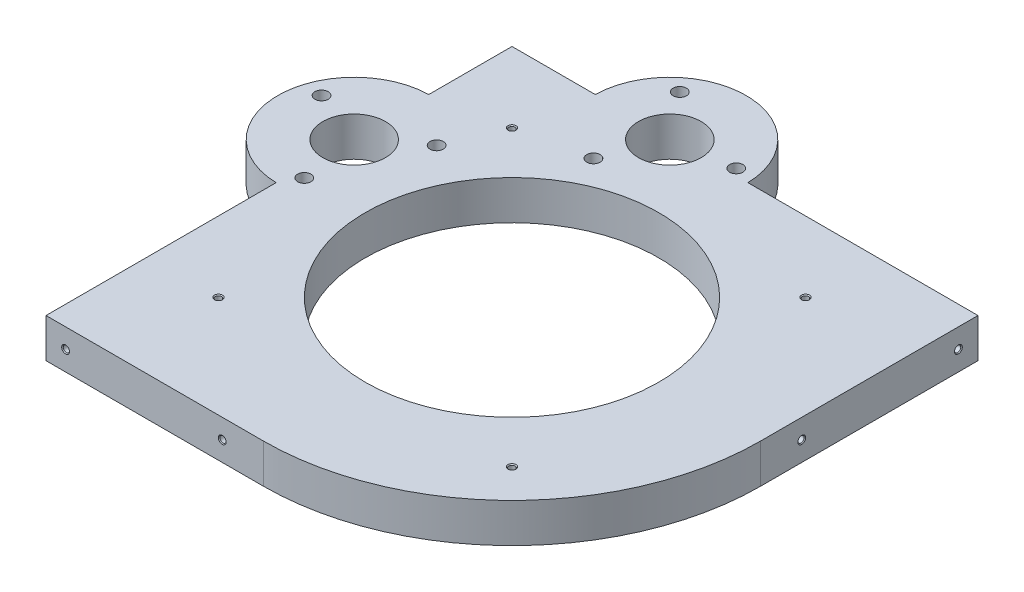
ISO-10303-21;
HEADER;
FILE_DESCRIPTION(('STEP AP214'),'2;1');
FILE_NAME('part.step','',(''),(''),'','','');
FILE_SCHEMA(('AUTOMOTIVE_DESIGN { 1 0 10303 214 1 1 1 1 }'));
ENDSEC;
DATA;
#1=APPLICATION_CONTEXT('core data for automotive mechanical design processes');
#2=APPLICATION_PROTOCOL_DEFINITION('international standard','automotive_design',2000,#1);
#3=PRODUCT_CONTEXT('',#1,'mechanical');
#4=PRODUCT('Part','Part','',(#3));
#5=PRODUCT_RELATED_PRODUCT_CATEGORY('part','',(#4));
#6=PRODUCT_DEFINITION_FORMATION('','',#4);
#7=PRODUCT_DEFINITION_CONTEXT('part definition',#1,'design');
#8=PRODUCT_DEFINITION('design','',#6,#7);
#9=PRODUCT_DEFINITION_SHAPE('','',#8);
#10=(LENGTH_UNIT() NAMED_UNIT(*) SI_UNIT(.MILLI.,.METRE.));
#11=(NAMED_UNIT(*) PLANE_ANGLE_UNIT() SI_UNIT($,.RADIAN.));
#12=(NAMED_UNIT(*) SI_UNIT($,.STERADIAN.) SOLID_ANGLE_UNIT());
#13=UNCERTAINTY_MEASURE_WITH_UNIT(LENGTH_MEASURE(1.E-05),#10,'distance_accuracy_value','');
#14=(GEOMETRIC_REPRESENTATION_CONTEXT(3) GLOBAL_UNCERTAINTY_ASSIGNED_CONTEXT((#13)) GLOBAL_UNIT_ASSIGNED_CONTEXT((#10,
#11,#12)) REPRESENTATION_CONTEXT('',''));
#15=CARTESIAN_POINT('',(0.,0.,0.));
#16=DIRECTION('',(0.,0.,1.));
#17=DIRECTION('',(1.,0.,0.));
#18=AXIS2_PLACEMENT_3D('',#15,#16,#17);
#19=CARTESIAN_POINT('',(0.,0.,0.));
#20=DIRECTION('',(0.,1.,0.));
#21=DIRECTION('',(0.,0.,1.));
#22=AXIS2_PLACEMENT_3D('',#19,#20,#21);
#23=PLANE('',#22);
#24=CARTESIAN_POINT('',(-68.9755902570555,0.,-20.3468197938255));
#25=DIRECTION('',(0.,-1.,0.));
#26=DIRECTION('',(0.,0.,-1.));
#27=AXIS2_PLACEMENT_3D('',#24,#25,#26);
#28=CIRCLE('',#27,1.69999999999999);
#29=CARTESIAN_POINT('',(-68.9755902570555,0.,-22.0468197938255));
#30=VERTEX_POINT('',#29);
#31=EDGE_CURVE('E576',#30,#30,#28,.T.);
#32=ORIENTED_EDGE('',*,*,#31,.F.);
#33=EDGE_LOOP('',(#32));
#34=FACE_BOUND('',#33,.T.);
#35=CARTESIAN_POINT('',(-43.254200669905,0.,-24.0088025499335));
#36=DIRECTION('',(0.,-1.,0.));
#37=DIRECTION('',(0.,0.,-1.));
#38=AXIS2_PLACEMENT_3D('',#35,#36,#37);
#39=CIRCLE('',#38,1.69999999999999);
#40=CARTESIAN_POINT('',(-43.254200669905,0.,-25.7088025499335));
#41=VERTEX_POINT('',#40);
#42=EDGE_CURVE('E588',#41,#41,#39,.T.);
#43=ORIENTED_EDGE('',*,*,#42,.F.);
#44=EDGE_LOOP('',(#43));
#45=FACE_BOUND('',#44,.T.);
#46=CARTESIAN_POINT('',(-20.3468197938259,0.,-41.139953939898));
#47=DIRECTION('',(0.,-1.,0.));
#48=DIRECTION('',(0.,0.,-1.));
#49=AXIS2_PLACEMENT_3D('',#46,#47,#48);
#50=CIRCLE('',#49,1.69999999999999);
#51=CARTESIAN_POINT('',(-20.3468197938259,0.,-42.839953939898));
#52=VERTEX_POINT('',#51);
#53=EDGE_CURVE('E594',#52,#52,#50,.T.);
#54=ORIENTED_EDGE('',*,*,#53,.F.);
#55=EDGE_LOOP('',(#54));
#56=FACE_BOUND('',#55,.T.);
#57=CARTESIAN_POINT('',(0.0975656312287576,0.,-57.1720188284834));
#58=DIRECTION('',(0.,-1.,0.));
#59=DIRECTION('',(0.,0.,-1.));
#60=AXIS2_PLACEMENT_3D('',#57,#58,#59);
#61=CIRCLE('',#60,1.69999999999999);
#62=CARTESIAN_POINT('',(0.0975656312287576,0.,-58.8720188284834));
#63=VERTEX_POINT('',#62);
#64=EDGE_CURVE('E600',#63,#63,#61,.T.);
#65=ORIENTED_EDGE('',*,*,#64,.F.);
#66=EDGE_LOOP('',(#65));
#67=FACE_BOUND('',#66,.T.);
#68=CARTESIAN_POINT('',(-14.7526855708436,0.,-55.0577720984769));
#69=DIRECTION('',(0.,1.,0.));
#70=DIRECTION('',(0.,0.,1.));
#71=AXIS2_PLACEMENT_3D('',#68,#69,#70);
#72=CIRCLE('',#71,8.);
#73=CARTESIAN_POINT('',(-14.7526855708436,0.,-47.0577720984769));
#74=VERTEX_POINT('',#73);
#75=EDGE_CURVE('E505',#74,#74,#72,.T.);
#76=ORIENTED_EDGE('',*,*,#75,.T.);
#77=EDGE_LOOP('',(#76));
#78=FACE_BOUND('',#77,.T.);
#79=CARTESIAN_POINT('',(-55.0577720984769,0.,-14.7526855708436));
#80=DIRECTION('',(0.,1.,0.));
#81=DIRECTION('',(0.,0.,1.));
#82=AXIS2_PLACEMENT_3D('',#79,#80,#81);
#83=CIRCLE('',#82,8.);
#84=CARTESIAN_POINT('',(-55.0577720984769,0.,-6.75268557084363));
#85=VERTEX_POINT('',#84);
#86=EDGE_CURVE('E501',#85,#85,#83,.T.);
#87=ORIENTED_EDGE('',*,*,#86,.T.);
#88=EDGE_LOOP('',(#87));
#89=FACE_BOUND('',#88,.T.);
#90=CARTESIAN_POINT('',(-14.7526855708436,0.,-55.0577720984769));
#91=DIRECTION('',(0.,1.,0.));
#92=DIRECTION('',(0.,0.,1.));
#93=AXIS2_PLACEMENT_3D('',#90,#91,#92);
#94=CIRCLE('',#93,19.5);
#95=CARTESIAN_POINT('',(4.74229928380845,0.,-55.5));
#96=VERTEX_POINT('',#95);
#97=CARTESIAN_POINT('',(-34.2476704254957,0.,-55.5));
#98=VERTEX_POINT('',#97);
#99=EDGE_CURVE('E511',#96,#98,#94,.T.);
#100=ORIENTED_EDGE('',*,*,#99,.F.);
#101=DIRECTION('',(-1.,0.,0.));
#102=VECTOR('',#101,1.);
#103=CARTESIAN_POINT('',(-55.5,0.,-55.5));
#104=LINE('',#103,#102);
#105=CARTESIAN_POINT('',(63.5,0.,-55.5));
#106=VERTEX_POINT('',#105);
#107=EDGE_CURVE('E166',#106,#96,#104,.T.);
#108=ORIENTED_EDGE('',*,*,#107,.F.);
#109=DIRECTION('',(0.,0.,-1.));
#110=VECTOR('',#109,1.);
#111=CARTESIAN_POINT('',(63.5,0.,0.));
#112=LINE('',#111,#110);
#113=CARTESIAN_POINT('',(63.5,0.,0.));
#114=VERTEX_POINT('',#113);
#115=EDGE_CURVE('E189',#114,#106,#112,.T.);
#116=ORIENTED_EDGE('',*,*,#115,.F.);
#117=CARTESIAN_POINT('',(0.,0.,0.));
#118=DIRECTION('',(0.,1.,0.));
#119=DIRECTION('',(0.,0.,1.));
#120=AXIS2_PLACEMENT_3D('',#117,#118,#119);
#121=CIRCLE('',#120,63.5);
#122=CARTESIAN_POINT('',(0.,0.,63.5));
#123=VERTEX_POINT('',#122);
#124=EDGE_CURVE('E186',#123,#114,#121,.T.);
#125=ORIENTED_EDGE('',*,*,#124,.F.);
#126=DIRECTION('',(1.,0.,0.));
#127=VECTOR('',#126,1.);
#128=CARTESIAN_POINT('',(0.,0.,63.5));
#129=LINE('',#128,#127);
#130=CARTESIAN_POINT('',(-55.5,0.,63.5));
#131=VERTEX_POINT('',#130);
#132=EDGE_CURVE('E182',#131,#123,#129,.T.);
#133=ORIENTED_EDGE('',*,*,#132,.F.);
#134=DIRECTION('',(0.,0.,1.));
#135=VECTOR('',#134,1.);
#136=CARTESIAN_POINT('',(-55.5,0.,-55.5));
#137=LINE('',#136,#135);
#138=CARTESIAN_POINT('',(-55.5,0.,4.74229928380845));
#139=VERTEX_POINT('',#138);
#140=EDGE_CURVE('E183',#139,#131,#137,.T.);
#141=ORIENTED_EDGE('',*,*,#140,.F.);
#142=CARTESIAN_POINT('',(-55.0577720984769,0.,-14.7526855708436));
#143=DIRECTION('',(0.,1.,0.));
#144=DIRECTION('',(0.,0.,-1.));
#145=AXIS2_PLACEMENT_3D('',#142,#143,#144);
#146=CIRCLE('',#145,19.5);
#147=CARTESIAN_POINT('',(-55.5,0.,-34.2476704254957));
#148=VERTEX_POINT('',#147);
#149=EDGE_CURVE('E140',#148,#139,#146,.T.);
#150=ORIENTED_EDGE('',*,*,#149,.F.);
#151=CARTESIAN_POINT('',(-55.5,0.,-55.5));
#152=VERTEX_POINT('',#151);
#153=EDGE_CURVE('E149',#152,#148,#137,.T.);
#154=ORIENTED_EDGE('',*,*,#153,.F.);
#155=EDGE_CURVE('E192',#98,#152,#104,.T.);
#156=ORIENTED_EDGE('',*,*,#155,.F.);
#157=EDGE_LOOP('',(#100,#108,#116,#125,#133,#141,#150,#154,#156));
#158=FACE_BOUND('',#157,.T.);
#159=CARTESIAN_POINT('',(-37.476659402887,0.,-37.476659402887));
#160=DIRECTION('',(0.,1.,0.));
#161=DIRECTION('',(0.,0.,1.));
#162=AXIS2_PLACEMENT_3D('',#159,#160,#161);
#163=CIRCLE('',#162,0.799999999999988);
#164=CARTESIAN_POINT('',(-37.476659402887,0.,-36.676659402887));
#165=VERTEX_POINT('',#164);
#166=EDGE_CURVE('E293',#165,#165,#163,.T.);
#167=ORIENTED_EDGE('',*,*,#166,.T.);
#168=EDGE_LOOP('',(#167));
#169=FACE_BOUND('',#168,.T.);
#170=CARTESIAN_POINT('',(0.,0.,0.));
#171=DIRECTION('',(0.,1.,0.));
#172=DIRECTION('',(0.,0.,1.));
#173=AXIS2_PLACEMENT_3D('',#170,#171,#172);
#174=CIRCLE('',#173,37.5);
#175=CARTESIAN_POINT('',(0.,0.,37.5));
#176=VERTEX_POINT('',#175);
#177=EDGE_CURVE('E168',#176,#176,#174,.T.);
#178=ORIENTED_EDGE('',*,*,#177,.T.);
#179=EDGE_LOOP('',(#178));
#180=FACE_BOUND('',#179,.T.);
#181=CARTESIAN_POINT('',(37.476659402887,0.,37.476659402887));
#182=DIRECTION('',(0.,1.,0.));
#183=DIRECTION('',(0.,0.,1.));
#184=AXIS2_PLACEMENT_3D('',#181,#182,#183);
#185=CIRCLE('',#184,0.799999999999988);
#186=CARTESIAN_POINT('',(37.476659402887,0.,38.276659402887));
#187=VERTEX_POINT('',#186);
#188=EDGE_CURVE('E317',#187,#187,#185,.T.);
#189=ORIENTED_EDGE('',*,*,#188,.T.);
#190=EDGE_LOOP('',(#189));
#191=FACE_BOUND('',#190,.T.);
#192=CARTESIAN_POINT('',(-37.476659402887,0.,37.476659402887));
#193=DIRECTION('',(0.,1.,0.));
#194=DIRECTION('',(0.,0.,1.));
#195=AXIS2_PLACEMENT_3D('',#192,#193,#194);
#196=CIRCLE('',#195,0.799999999999988);
#197=CARTESIAN_POINT('',(-37.476659402887,0.,38.276659402887));
#198=VERTEX_POINT('',#197);
#199=EDGE_CURVE('E305',#198,#198,#196,.T.);
#200=ORIENTED_EDGE('',*,*,#199,.T.);
#201=EDGE_LOOP('',(#200));
#202=FACE_BOUND('',#201,.T.);
#203=CARTESIAN_POINT('',(37.476659402887,0.,-37.476659402887));
#204=DIRECTION('',(0.,1.,0.));
#205=DIRECTION('',(0.,0.,1.));
#206=AXIS2_PLACEMENT_3D('',#203,#204,#205);
#207=CIRCLE('',#206,0.799999999999988);
#208=CARTESIAN_POINT('',(37.476659402887,0.,-36.676659402887));
#209=VERTEX_POINT('',#208);
#210=EDGE_CURVE('E281',#209,#209,#207,.T.);
#211=ORIENTED_EDGE('',*,*,#210,.T.);
#212=EDGE_LOOP('',(#211));
#213=FACE_BOUND('',#212,.T.);
#214=CARTESIAN_POINT('',(-24.0088025499339,0.,-66.8613435270484));
#215=DIRECTION('',(0.,-1.,0.));
#216=DIRECTION('',(0.,0.,-1.));
#217=AXIS2_PLACEMENT_3D('',#214,#215,#216);
#218=CIRCLE('',#217,1.69999999999999);
#219=CARTESIAN_POINT('',(-24.0088025499339,0.,-68.5613435270484));
#220=VERTEX_POINT('',#219);
#221=EDGE_CURVE('E606',#220,#220,#218,.T.);
#222=ORIENTED_EDGE('',*,*,#221,.F.);
#223=EDGE_LOOP('',(#222));
#224=FACE_BOUND('',#223,.T.);
#225=CARTESIAN_POINT('',(-52.94352536847,0.,0.0975656312292017));
#226=DIRECTION('',(0.,-1.,0.));
#227=DIRECTION('',(0.,0.,-1.));
#228=AXIS2_PLACEMENT_3D('',#225,#226,#227);
#229=CIRCLE('',#228,1.69999999999999);
#230=CARTESIAN_POINT('',(-52.94352536847,0.,-1.60243436877079));
#231=VERTEX_POINT('',#230);
#232=EDGE_CURVE('E580',#231,#231,#229,.T.);
#233=ORIENTED_EDGE('',*,*,#232,.F.);
#234=EDGE_LOOP('',(#233));
#235=FACE_BOUND('',#234,.T.);
#236=ADVANCED_FACE('F50',(#34,#45,#56,#67,#78,#89,#158,#169,#180,#191,#202,#213,#224,#235),#23,.F.);
#237=CARTESIAN_POINT('',(-55.5,10.,-55.5));
#238=DIRECTION('',(1.,0.,0.));
#239=DIRECTION('',(0.,0.,-1.));
#240=AXIS2_PLACEMENT_3D('',#237,#238,#239);
#241=PLANE('',#240);
#242=ORIENTED_EDGE('',*,*,#153,.T.);
#243=DIRECTION('',(0.,1.,0.));
#244=VECTOR('',#243,1.);
#245=CARTESIAN_POINT('',(-55.5,0.,-34.2476704254957));
#246=LINE('',#245,#244);
#247=CARTESIAN_POINT('',(-55.5,10.,-34.2476704254957));
#248=VERTEX_POINT('',#247);
#249=EDGE_CURVE('E134',#148,#248,#246,.T.);
#250=ORIENTED_EDGE('',*,*,#249,.T.);
#251=DIRECTION('',(0.,0.,1.));
#252=VECTOR('',#251,1.);
#253=CARTESIAN_POINT('',(-55.5,10.,-55.5));
#254=LINE('',#253,#252);
#255=CARTESIAN_POINT('',(-55.5,10.,-55.5));
#256=VERTEX_POINT('',#255);
#257=EDGE_CURVE('E147',#256,#248,#254,.T.);
#258=ORIENTED_EDGE('',*,*,#257,.F.);
#259=DIRECTION('',(0.,-1.,0.));
#260=VECTOR('',#259,1.);
#261=CARTESIAN_POINT('',(-55.5,10.,-55.5));
#262=LINE('',#261,#260);
#263=EDGE_CURVE('E179',#256,#152,#262,.T.);
#264=ORIENTED_EDGE('',*,*,#263,.T.);
#265=EDGE_LOOP('',(#242,#250,#258,#264));
#266=FACE_BOUND('',#265,.T.);
#267=ADVANCED_FACE('F145',(#266),#241,.F.);
#268=CARTESIAN_POINT('',(-55.5,10.,-55.5));
#269=DIRECTION('',(0.,0.,1.));
#270=DIRECTION('',(1.,0.,0.));
#271=AXIS2_PLACEMENT_3D('',#268,#269,#270);
#272=PLANE('',#271);
#273=ORIENTED_EDGE('',*,*,#107,.T.);
#274=DIRECTION('',(0.,1.,0.));
#275=VECTOR('',#274,1.);
#276=CARTESIAN_POINT('',(4.74229928380845,0.,-55.5));
#277=LINE('',#276,#275);
#278=CARTESIAN_POINT('',(4.74229928380845,10.,-55.5));
#279=VERTEX_POINT('',#278);
#280=EDGE_CURVE('E523',#96,#279,#277,.T.);
#281=ORIENTED_EDGE('',*,*,#280,.T.);
#282=DIRECTION('',(-1.,0.,0.));
#283=VECTOR('',#282,1.);
#284=CARTESIAN_POINT('',(-55.5,10.,-55.5));
#285=LINE('',#284,#283);
#286=CARTESIAN_POINT('',(63.5,10.,-55.5));
#287=VERTEX_POINT('',#286);
#288=EDGE_CURVE('E176',#287,#279,#285,.T.);
#289=ORIENTED_EDGE('',*,*,#288,.F.);
#290=DIRECTION('',(0.,-1.,0.));
#291=VECTOR('',#290,1.);
#292=CARTESIAN_POINT('',(63.5,10.,-55.5));
#293=LINE('',#292,#291);
#294=EDGE_CURVE('E198',#287,#106,#293,.T.);
#295=ORIENTED_EDGE('',*,*,#294,.T.);
#296=EDGE_LOOP('',(#273,#281,#289,#295));
#297=FACE_BOUND('',#296,.T.);
#298=ADVANCED_FACE('F348',(#297),#272,.F.);
#299=CARTESIAN_POINT('',(0.,10.,0.));
#300=DIRECTION('',(0.,1.,0.));
#301=DIRECTION('',(0.,0.,1.));
#302=AXIS2_PLACEMENT_3D('',#299,#300,#301);
#303=PLANE('',#302);
#304=CARTESIAN_POINT('',(-68.9755902570555,10.,-20.3468197938255));
#305=DIRECTION('',(0.,-1.,0.));
#306=DIRECTION('',(0.,0.,-1.));
#307=AXIS2_PLACEMENT_3D('',#304,#305,#306);
#308=CIRCLE('',#307,1.69999999999999);
#309=CARTESIAN_POINT('',(-68.9755902570555,10.,-22.0468197938255));
#310=VERTEX_POINT('',#309);
#311=EDGE_CURVE('E471',#310,#310,#308,.T.);
#312=ORIENTED_EDGE('',*,*,#311,.T.);
#313=EDGE_LOOP('',(#312));
#314=FACE_BOUND('',#313,.T.);
#315=CARTESIAN_POINT('',(-52.94352536847,10.,0.0975656312292017));
#316=DIRECTION('',(0.,-1.,0.));
#317=DIRECTION('',(0.,0.,-1.));
#318=AXIS2_PLACEMENT_3D('',#315,#316,#317);
#319=CIRCLE('',#318,1.69999999999999);
#320=CARTESIAN_POINT('',(-52.94352536847,10.,-1.60243436877079));
#321=VERTEX_POINT('',#320);
#322=EDGE_CURVE('E475',#321,#321,#319,.T.);
#323=ORIENTED_EDGE('',*,*,#322,.T.);
#324=EDGE_LOOP('',(#323));
#325=FACE_BOUND('',#324,.T.);
#326=CARTESIAN_POINT('',(-43.254200669905,10.,-24.0088025499335));
#327=DIRECTION('',(0.,-1.,0.));
#328=DIRECTION('',(0.,0.,-1.));
#329=AXIS2_PLACEMENT_3D('',#326,#327,#328);
#330=CIRCLE('',#329,1.69999999999999);
#331=CARTESIAN_POINT('',(-43.254200669905,10.,-25.7088025499335));
#332=VERTEX_POINT('',#331);
#333=EDGE_CURVE('E479',#332,#332,#330,.T.);
#334=ORIENTED_EDGE('',*,*,#333,.T.);
#335=EDGE_LOOP('',(#334));
#336=FACE_BOUND('',#335,.T.);
#337=CARTESIAN_POINT('',(-20.3468197938259,10.,-41.139953939898));
#338=DIRECTION('',(0.,-1.,0.));
#339=DIRECTION('',(0.,0.,-1.));
#340=AXIS2_PLACEMENT_3D('',#337,#338,#339);
#341=CIRCLE('',#340,1.69999999999999);
#342=CARTESIAN_POINT('',(-20.3468197938259,10.,-42.839953939898));
#343=VERTEX_POINT('',#342);
#344=EDGE_CURVE('E483',#343,#343,#341,.T.);
#345=ORIENTED_EDGE('',*,*,#344,.T.);
#346=EDGE_LOOP('',(#345));
#347=FACE_BOUND('',#346,.T.);
#348=CARTESIAN_POINT('',(0.0975656312287576,10.,-57.1720188284834));
#349=DIRECTION('',(0.,-1.,0.));
#350=DIRECTION('',(0.,0.,-1.));
#351=AXIS2_PLACEMENT_3D('',#348,#349,#350);
#352=CIRCLE('',#351,1.69999999999999);
#353=CARTESIAN_POINT('',(0.0975656312287576,10.,-58.8720188284834));
#354=VERTEX_POINT('',#353);
#355=EDGE_CURVE('E487',#354,#354,#352,.T.);
#356=ORIENTED_EDGE('',*,*,#355,.T.);
#357=EDGE_LOOP('',(#356));
#358=FACE_BOUND('',#357,.T.);
#359=CARTESIAN_POINT('',(-24.0088025499339,10.,-66.8613435270484));
#360=DIRECTION('',(0.,-1.,0.));
#361=DIRECTION('',(0.,0.,-1.));
#362=AXIS2_PLACEMENT_3D('',#359,#360,#361);
#363=CIRCLE('',#362,1.69999999999999);
#364=CARTESIAN_POINT('',(-24.0088025499339,10.,-68.5613435270484));
#365=VERTEX_POINT('',#364);
#366=EDGE_CURVE('E491',#365,#365,#363,.T.);
#367=ORIENTED_EDGE('',*,*,#366,.T.);
#368=EDGE_LOOP('',(#367));
#369=FACE_BOUND('',#368,.T.);
#370=CARTESIAN_POINT('',(-14.7526855708436,10.,-55.0577720984769));
#371=DIRECTION('',(0.,1.,0.));
#372=DIRECTION('',(0.,0.,1.));
#373=AXIS2_PLACEMENT_3D('',#370,#371,#372);
#374=CIRCLE('',#373,8.);
#375=CARTESIAN_POINT('',(-14.7526855708436,10.,-47.0577720984769));
#376=VERTEX_POINT('',#375);
#377=EDGE_CURVE('E495',#376,#376,#374,.T.);
#378=ORIENTED_EDGE('',*,*,#377,.F.);
#379=EDGE_LOOP('',(#378));
#380=FACE_BOUND('',#379,.T.);
#381=CARTESIAN_POINT('',(-55.0577720984769,10.,-14.7526855708436));
#382=DIRECTION('',(0.,1.,0.));
#383=DIRECTION('',(0.,0.,1.));
#384=AXIS2_PLACEMENT_3D('',#381,#382,#383);
#385=CIRCLE('',#384,8.);
#386=CARTESIAN_POINT('',(-55.0577720984769,10.,-6.75268557084363));
#387=VERTEX_POINT('',#386);
#388=EDGE_CURVE('E498',#387,#387,#385,.T.);
#389=ORIENTED_EDGE('',*,*,#388,.F.);
#390=EDGE_LOOP('',(#389));
#391=FACE_BOUND('',#390,.T.);
#392=ORIENTED_EDGE('',*,*,#288,.T.);
#393=CARTESIAN_POINT('',(-14.7526855708436,10.,-55.0577720984769));
#394=DIRECTION('',(0.,1.,0.));
#395=DIRECTION('',(0.,0.,1.));
#396=AXIS2_PLACEMENT_3D('',#393,#394,#395);
#397=CIRCLE('',#396,19.5);
#398=CARTESIAN_POINT('',(-34.2476704254957,10.,-55.5));
#399=VERTEX_POINT('',#398);
#400=EDGE_CURVE('E74',#279,#399,#397,.T.);
#401=ORIENTED_EDGE('',*,*,#400,.T.);
#402=EDGE_CURVE('E156',#399,#256,#285,.T.);
#403=ORIENTED_EDGE('',*,*,#402,.T.);
#404=ORIENTED_EDGE('',*,*,#257,.T.);
#405=CARTESIAN_POINT('',(-55.0577720984769,10.,-14.7526855708436));
#406=DIRECTION('',(0.,1.,0.));
#407=DIRECTION('',(0.,0.,-1.));
#408=AXIS2_PLACEMENT_3D('',#405,#406,#407);
#409=CIRCLE('',#408,19.5);
#410=CARTESIAN_POINT('',(-55.5,10.,4.74229928380845));
#411=VERTEX_POINT('',#410);
#412=EDGE_CURVE('E67',#248,#411,#409,.T.);
#413=ORIENTED_EDGE('',*,*,#412,.T.);
#414=CARTESIAN_POINT('',(-55.5,10.,63.5));
#415=VERTEX_POINT('',#414);
#416=EDGE_CURVE('E160',#411,#415,#254,.T.);
#417=ORIENTED_EDGE('',*,*,#416,.T.);
#418=DIRECTION('',(1.,0.,0.));
#419=VECTOR('',#418,1.);
#420=CARTESIAN_POINT('',(0.,10.,63.5));
#421=LINE('',#420,#419);
#422=CARTESIAN_POINT('',(0.,10.,63.5));
#423=VERTEX_POINT('',#422);
#424=EDGE_CURVE('E159',#415,#423,#421,.T.);
#425=ORIENTED_EDGE('',*,*,#424,.T.);
#426=CARTESIAN_POINT('',(0.,10.,0.));
#427=DIRECTION('',(0.,1.,0.));
#428=DIRECTION('',(0.,0.,1.));
#429=AXIS2_PLACEMENT_3D('',#426,#427,#428);
#430=CIRCLE('',#429,63.5);
#431=CARTESIAN_POINT('',(63.5,10.,0.));
#432=VERTEX_POINT('',#431);
#433=EDGE_CURVE('E164',#423,#432,#430,.T.);
#434=ORIENTED_EDGE('',*,*,#433,.T.);
#435=DIRECTION('',(0.,0.,-1.));
#436=VECTOR('',#435,1.);
#437=CARTESIAN_POINT('',(63.5,10.,0.));
#438=LINE('',#437,#436);
#439=EDGE_CURVE('E173',#432,#287,#438,.T.);
#440=ORIENTED_EDGE('',*,*,#439,.T.);
#441=EDGE_LOOP('',(#392,#401,#403,#404,#413,#417,#425,#434,#440));
#442=FACE_BOUND('',#441,.T.);
#443=CARTESIAN_POINT('',(0.,10.,0.));
#444=DIRECTION('',(0.,1.,0.));
#445=DIRECTION('',(0.,0.,1.));
#446=AXIS2_PLACEMENT_3D('',#443,#444,#445);
#447=CIRCLE('',#446,37.5);
#448=CARTESIAN_POINT('',(0.,10.,37.5));
#449=VERTEX_POINT('',#448);
#450=EDGE_CURVE('E320',#449,#449,#447,.T.);
#451=ORIENTED_EDGE('',*,*,#450,.F.);
#452=EDGE_LOOP('',(#451));
#453=FACE_BOUND('',#452,.T.);
#454=CARTESIAN_POINT('',(-37.476659402887,10.,-37.476659402887));
#455=DIRECTION('',(0.,1.,0.));
#456=DIRECTION('',(0.,0.,1.));
#457=AXIS2_PLACEMENT_3D('',#454,#455,#456);
#458=CIRCLE('',#457,1.025);
#459=CARTESIAN_POINT('',(-37.476659402887,10.,-36.451659402887));
#460=VERTEX_POINT('',#459);
#461=EDGE_CURVE('E285',#460,#460,#458,.T.);
#462=ORIENTED_EDGE('',*,*,#461,.F.);
#463=EDGE_LOOP('',(#462));
#464=FACE_BOUND('',#463,.T.);
#465=CARTESIAN_POINT('',(37.476659402887,10.,37.476659402887));
#466=DIRECTION('',(0.,1.,0.));
#467=DIRECTION('',(0.,0.,1.));
#468=AXIS2_PLACEMENT_3D('',#465,#466,#467);
#469=CIRCLE('',#468,1.025);
#470=CARTESIAN_POINT('',(37.476659402887,10.,38.501659402887));
#471=VERTEX_POINT('',#470);
#472=EDGE_CURVE('E309',#471,#471,#469,.T.);
#473=ORIENTED_EDGE('',*,*,#472,.F.);
#474=EDGE_LOOP('',(#473));
#475=FACE_BOUND('',#474,.T.);
#476=CARTESIAN_POINT('',(-37.476659402887,10.,37.476659402887));
#477=DIRECTION('',(0.,1.,0.));
#478=DIRECTION('',(0.,0.,1.));
#479=AXIS2_PLACEMENT_3D('',#476,#477,#478);
#480=CIRCLE('',#479,1.025);
#481=CARTESIAN_POINT('',(-37.476659402887,10.,38.501659402887));
#482=VERTEX_POINT('',#481);
#483=EDGE_CURVE('E297',#482,#482,#480,.T.);
#484=ORIENTED_EDGE('',*,*,#483,.F.);
#485=EDGE_LOOP('',(#484));
#486=FACE_BOUND('',#485,.T.);
#487=CARTESIAN_POINT('',(37.476659402887,10.,-37.476659402887));
#488=DIRECTION('',(0.,1.,0.));
#489=DIRECTION('',(0.,0.,1.));
#490=AXIS2_PLACEMENT_3D('',#487,#488,#489);
#491=CIRCLE('',#490,1.025);
#492=CARTESIAN_POINT('',(37.476659402887,10.,-36.451659402887));
#493=VERTEX_POINT('',#492);
#494=EDGE_CURVE('E267',#493,#493,#491,.T.);
#495=ORIENTED_EDGE('',*,*,#494,.F.);
#496=EDGE_LOOP('',(#495));
#497=FACE_BOUND('',#496,.T.);
#498=ADVANCED_FACE('F153',(#314,#325,#336,#347,#358,#369,#380,#391,#442,#453,#464,#475,#486,
#497),#303,.T.);
#499=ORIENTED_EDGE('',*,*,#416,.F.);
#500=DIRECTION('',(0.,1.,0.));
#501=VECTOR('',#500,1.);
#502=CARTESIAN_POINT('',(-55.5,0.,4.74229928380845));
#503=LINE('',#502,#501);
#504=EDGE_CURVE('E137',#411,#139,#503,.F.);
#505=ORIENTED_EDGE('',*,*,#504,.T.);
#506=ORIENTED_EDGE('',*,*,#140,.T.);
#507=DIRECTION('',(0.,-1.,0.));
#508=VECTOR('',#507,1.);
#509=CARTESIAN_POINT('',(-55.5,10.,63.5));
#510=LINE('',#509,#508);
#511=EDGE_CURVE('E210',#415,#131,#510,.T.);
#512=ORIENTED_EDGE('',*,*,#511,.F.);
#513=EDGE_LOOP('',(#499,#505,#506,#512));
#514=FACE_BOUND('',#513,.T.);
#515=ADVANCED_FACE('F359',(#514),#241,.F.);
#516=CARTESIAN_POINT('',(0.,10.,63.5));
#517=DIRECTION('',(0.,0.,-1.));
#518=DIRECTION('',(-1.,0.,0.));
#519=AXIS2_PLACEMENT_3D('',#516,#517,#518);
#520=PLANE('',#519);
#521=CARTESIAN_POINT('',(-50.5,5.,63.5));
#522=DIRECTION('',(0.,0.,-1.));
#523=DIRECTION('',(-1.,0.,0.));
#524=AXIS2_PLACEMENT_3D('',#521,#522,#523);
#525=CIRCLE('',#524,0.999999999999959);
#526=CARTESIAN_POINT('',(-51.5,5.,63.5));
#527=VERTEX_POINT('',#526);
#528=EDGE_CURVE('E60',#527,#527,#525,.T.);
#529=ORIENTED_EDGE('',*,*,#528,.T.);
#530=EDGE_LOOP('',(#529));
#531=FACE_BOUND('',#530,.T.);
#532=CARTESIAN_POINT('',(-10.5,5.,63.5));
#533=DIRECTION('',(0.,0.,-1.));
#534=DIRECTION('',(-1.,0.,0.));
#535=AXIS2_PLACEMENT_3D('',#532,#533,#534);
#536=CIRCLE('',#535,1.);
#537=CARTESIAN_POINT('',(-11.5,5.,63.5));
#538=VERTEX_POINT('',#537);
#539=EDGE_CURVE('E234',#538,#538,#536,.T.);
#540=ORIENTED_EDGE('',*,*,#539,.T.);
#541=EDGE_LOOP('',(#540));
#542=FACE_BOUND('',#541,.T.);
#543=ORIENTED_EDGE('',*,*,#132,.T.);
#544=DIRECTION('',(0.,-1.,0.));
#545=VECTOR('',#544,1.);
#546=CARTESIAN_POINT('',(0.,10.,63.5));
#547=LINE('',#546,#545);
#548=EDGE_CURVE('E206',#423,#123,#547,.T.);
#549=ORIENTED_EDGE('',*,*,#548,.F.);
#550=ORIENTED_EDGE('',*,*,#424,.F.);
#551=ORIENTED_EDGE('',*,*,#511,.T.);
#552=EDGE_LOOP('',(#543,#549,#550,#551));
#553=FACE_BOUND('',#552,.T.);
#554=ADVANCED_FACE('F241',(#531,#542,#553),#520,.F.);
#555=CARTESIAN_POINT('',(0.,10.,0.));
#556=DIRECTION('',(0.,-1.,0.));
#557=DIRECTION('',(0.,0.,-1.));
#558=AXIS2_PLACEMENT_3D('',#555,#556,#557);
#559=CYLINDRICAL_SURFACE('',#558,63.5);
#560=ORIENTED_EDGE('',*,*,#124,.T.);
#561=DIRECTION('',(0.,-1.,0.));
#562=VECTOR('',#561,1.);
#563=CARTESIAN_POINT('',(63.5,10.,0.));
#564=LINE('',#563,#562);
#565=EDGE_CURVE('E202',#432,#114,#564,.T.);
#566=ORIENTED_EDGE('',*,*,#565,.F.);
#567=ORIENTED_EDGE('',*,*,#433,.F.);
#568=ORIENTED_EDGE('',*,*,#548,.T.);
#569=EDGE_LOOP('',(#560,#566,#567,#568));
#570=FACE_BOUND('',#569,.T.);
#571=ADVANCED_FACE('F365',(#570),#559,.T.);
#572=CARTESIAN_POINT('',(63.5,10.,0.));
#573=DIRECTION('',(-1.,0.,0.));
#574=DIRECTION('',(0.,0.,1.));
#575=AXIS2_PLACEMENT_3D('',#572,#573,#574);
#576=PLANE('',#575);
#577=CARTESIAN_POINT('',(63.5,5.,-50.5));
#578=DIRECTION('',(-1.,0.,0.));
#579=DIRECTION('',(0.,0.,1.));
#580=AXIS2_PLACEMENT_3D('',#577,#578,#579);
#581=CIRCLE('',#580,0.999999999999959);
#582=CARTESIAN_POINT('',(63.5,5.,-49.5));
#583=VERTEX_POINT('',#582);
#584=EDGE_CURVE('E222',#583,#583,#581,.T.);
#585=ORIENTED_EDGE('',*,*,#584,.T.);
#586=EDGE_LOOP('',(#585));
#587=FACE_BOUND('',#586,.T.);
#588=CARTESIAN_POINT('',(63.5,5.,-10.5));
#589=DIRECTION('',(-1.,0.,0.));
#590=DIRECTION('',(0.,0.,1.));
#591=AXIS2_PLACEMENT_3D('',#588,#589,#590);
#592=CIRCLE('',#591,0.999999999999959);
#593=CARTESIAN_POINT('',(63.5,5.,-9.50000000000004));
#594=VERTEX_POINT('',#593);
#595=EDGE_CURVE('E218',#594,#594,#592,.T.);
#596=ORIENTED_EDGE('',*,*,#595,.T.);
#597=EDGE_LOOP('',(#596));
#598=FACE_BOUND('',#597,.T.);
#599=ORIENTED_EDGE('',*,*,#115,.T.);
#600=ORIENTED_EDGE('',*,*,#294,.F.);
#601=ORIENTED_EDGE('',*,*,#439,.F.);
#602=ORIENTED_EDGE('',*,*,#565,.T.);
#603=EDGE_LOOP('',(#599,#600,#601,#602));
#604=FACE_BOUND('',#603,.T.);
#605=ADVANCED_FACE('F345',(#587,#598,#604),#576,.F.);
#606=ORIENTED_EDGE('',*,*,#402,.F.);
#607=DIRECTION('',(0.,1.,0.));
#608=VECTOR('',#607,1.);
#609=CARTESIAN_POINT('',(-34.2476704254957,0.,-55.5));
#610=LINE('',#609,#608);
#611=EDGE_CURVE('E151',#399,#98,#610,.F.);
#612=ORIENTED_EDGE('',*,*,#611,.T.);
#613=ORIENTED_EDGE('',*,*,#155,.T.);
#614=ORIENTED_EDGE('',*,*,#263,.F.);
#615=EDGE_LOOP('',(#606,#612,#613,#614));
#616=FACE_BOUND('',#615,.T.);
#617=ADVANCED_FACE('F335',(#616),#272,.F.);
#618=CARTESIAN_POINT('',(0.,10.,0.));
#619=DIRECTION('',(0.,-1.,0.));
#620=DIRECTION('',(0.,0.,-1.));
#621=AXIS2_PLACEMENT_3D('',#618,#619,#620);
#622=CYLINDRICAL_SURFACE('',#621,37.5);
#623=ORIENTED_EDGE('',*,*,#450,.T.);
#624=EDGE_LOOP('',(#623));
#625=FACE_BOUND('',#624,.T.);
#626=ORIENTED_EDGE('',*,*,#177,.F.);
#627=EDGE_LOOP('',(#626));
#628=FACE_BOUND('',#627,.T.);
#629=ADVANCED_FACE('F332',(#625,#628),#622,.F.);
#630=CARTESIAN_POINT('',(37.476659402887,10.,37.476659402887));
#631=DIRECTION('',(0.,1.,0.));
#632=DIRECTION('',(0.,0.,1.));
#633=AXIS2_PLACEMENT_3D('',#630,#631,#632);
#634=CYLINDRICAL_SURFACE('',#633,0.799999999999995);
#635=ORIENTED_EDGE('',*,*,#188,.F.);
#636=EDGE_LOOP('',(#635));
#637=FACE_BOUND('',#636,.T.);
#638=CARTESIAN_POINT('',(37.476659402887,9.775,37.476659402887));
#639=DIRECTION('',(0.,1.,0.));
#640=DIRECTION('',(0.,0.,1.));
#641=AXIS2_PLACEMENT_3D('',#638,#639,#640);
#642=CIRCLE('',#641,0.800000000000002);
#643=CARTESIAN_POINT('',(37.476659402887,9.775,38.276659402887));
#644=VERTEX_POINT('',#643);
#645=EDGE_CURVE('E313',#644,#644,#642,.T.);
#646=ORIENTED_EDGE('',*,*,#645,.T.);
#647=EDGE_LOOP('',(#646));
#648=FACE_BOUND('',#647,.T.);
#649=ADVANCED_FACE('F334',(#637,#648),#634,.F.);
#650=CARTESIAN_POINT('',(37.476659402887,10.,37.476659402887));
#651=DIRECTION('',(0.,1.,0.));
#652=DIRECTION('',(0.,0.,1.));
#653=AXIS2_PLACEMENT_3D('',#650,#651,#652);
#654=CONICAL_SURFACE('',#653,1.025,0.785398163397437);
#655=ORIENTED_EDGE('',*,*,#645,.F.);
#656=EDGE_LOOP('',(#655));
#657=FACE_BOUND('',#656,.T.);
#658=ORIENTED_EDGE('',*,*,#472,.T.);
#659=EDGE_LOOP('',(#658));
#660=FACE_BOUND('',#659,.T.);
#661=ADVANCED_FACE('F342',(#657,#660),#654,.F.);
#662=CARTESIAN_POINT('',(-37.476659402887,10.,37.476659402887));
#663=DIRECTION('',(0.,1.,0.));
#664=DIRECTION('',(0.,0.,1.));
#665=AXIS2_PLACEMENT_3D('',#662,#663,#664);
#666=CYLINDRICAL_SURFACE('',#665,0.799999999999995);
#667=ORIENTED_EDGE('',*,*,#199,.F.);
#668=EDGE_LOOP('',(#667));
#669=FACE_BOUND('',#668,.T.);
#670=CARTESIAN_POINT('',(-37.476659402887,9.775,37.476659402887));
#671=DIRECTION('',(0.,1.,0.));
#672=DIRECTION('',(0.,0.,1.));
#673=AXIS2_PLACEMENT_3D('',#670,#671,#672);
#674=CIRCLE('',#673,0.800000000000002);
#675=CARTESIAN_POINT('',(-37.476659402887,9.775,38.276659402887));
#676=VERTEX_POINT('',#675);
#677=EDGE_CURVE('E301',#676,#676,#674,.T.);
#678=ORIENTED_EDGE('',*,*,#677,.T.);
#679=EDGE_LOOP('',(#678));
#680=FACE_BOUND('',#679,.T.);
#681=ADVANCED_FACE('F443',(#669,#680),#666,.F.);
#682=CARTESIAN_POINT('',(-37.476659402887,10.,37.476659402887));
#683=DIRECTION('',(0.,1.,0.));
#684=DIRECTION('',(0.,0.,1.));
#685=AXIS2_PLACEMENT_3D('',#682,#683,#684);
#686=CONICAL_SURFACE('',#685,1.025,0.785398163397437);
#687=ORIENTED_EDGE('',*,*,#677,.F.);
#688=EDGE_LOOP('',(#687));
#689=FACE_BOUND('',#688,.T.);
#690=ORIENTED_EDGE('',*,*,#483,.T.);
#691=EDGE_LOOP('',(#690));
#692=FACE_BOUND('',#691,.T.);
#693=ADVANCED_FACE('F439',(#689,#692),#686,.F.);
#694=CARTESIAN_POINT('',(-37.476659402887,10.,-37.476659402887));
#695=DIRECTION('',(0.,1.,0.));
#696=DIRECTION('',(0.,0.,1.));
#697=AXIS2_PLACEMENT_3D('',#694,#695,#696);
#698=CYLINDRICAL_SURFACE('',#697,0.799999999999995);
#699=ORIENTED_EDGE('',*,*,#166,.F.);
#700=EDGE_LOOP('',(#699));
#701=FACE_BOUND('',#700,.T.);
#702=CARTESIAN_POINT('',(-37.476659402887,9.775,-37.476659402887));
#703=DIRECTION('',(0.,1.,0.));
#704=DIRECTION('',(0.,0.,1.));
#705=AXIS2_PLACEMENT_3D('',#702,#703,#704);
#706=CIRCLE('',#705,0.800000000000002);
#707=CARTESIAN_POINT('',(-37.476659402887,9.775,-36.676659402887));
#708=VERTEX_POINT('',#707);
#709=EDGE_CURVE('E289',#708,#708,#706,.T.);
#710=ORIENTED_EDGE('',*,*,#709,.T.);
#711=EDGE_LOOP('',(#710));
#712=FACE_BOUND('',#711,.T.);
#713=ADVANCED_FACE('F435',(#701,#712),#698,.F.);
#714=CARTESIAN_POINT('',(-37.476659402887,10.,-37.476659402887));
#715=DIRECTION('',(0.,1.,0.));
#716=DIRECTION('',(0.,0.,1.));
#717=AXIS2_PLACEMENT_3D('',#714,#715,#716);
#718=CONICAL_SURFACE('',#717,1.025,0.785398163397437);
#719=ORIENTED_EDGE('',*,*,#709,.F.);
#720=EDGE_LOOP('',(#719));
#721=FACE_BOUND('',#720,.T.);
#722=ORIENTED_EDGE('',*,*,#461,.T.);
#723=EDGE_LOOP('',(#722));
#724=FACE_BOUND('',#723,.T.);
#725=ADVANCED_FACE('F431',(#721,#724),#718,.F.);
#726=CARTESIAN_POINT('',(37.476659402887,10.,-37.476659402887));
#727=DIRECTION('',(0.,1.,0.));
#728=DIRECTION('',(0.,0.,1.));
#729=AXIS2_PLACEMENT_3D('',#726,#727,#728);
#730=CYLINDRICAL_SURFACE('',#729,0.799999999999995);
#731=ORIENTED_EDGE('',*,*,#210,.F.);
#732=EDGE_LOOP('',(#731));
#733=FACE_BOUND('',#732,.T.);
#734=CARTESIAN_POINT('',(37.476659402887,9.775,-37.476659402887));
#735=DIRECTION('',(0.,1.,0.));
#736=DIRECTION('',(0.,0.,1.));
#737=AXIS2_PLACEMENT_3D('',#734,#735,#736);
#738=CIRCLE('',#737,0.800000000000002);
#739=CARTESIAN_POINT('',(37.476659402887,9.775,-36.676659402887));
#740=VERTEX_POINT('',#739);
#741=EDGE_CURVE('E277',#740,#740,#738,.T.);
#742=ORIENTED_EDGE('',*,*,#741,.T.);
#743=EDGE_LOOP('',(#742));
#744=FACE_BOUND('',#743,.T.);
#745=ADVANCED_FACE('F427',(#733,#744),#730,.F.);
#746=CARTESIAN_POINT('',(37.476659402887,10.,-37.476659402887));
#747=DIRECTION('',(0.,1.,0.));
#748=DIRECTION('',(0.,0.,1.));
#749=AXIS2_PLACEMENT_3D('',#746,#747,#748);
#750=CONICAL_SURFACE('',#749,1.025,0.785398163397437);
#751=ORIENTED_EDGE('',*,*,#741,.F.);
#752=EDGE_LOOP('',(#751));
#753=FACE_BOUND('',#752,.T.);
#754=ORIENTED_EDGE('',*,*,#494,.T.);
#755=EDGE_LOOP('',(#754));
#756=FACE_BOUND('',#755,.T.);
#757=ADVANCED_FACE('F423',(#753,#756),#750,.F.);
#758=CARTESIAN_POINT('',(-10.5,5.,57.5));
#759=DIRECTION('',(0.,0.,1.));
#760=DIRECTION('',(1.,0.,0.));
#761=AXIS2_PLACEMENT_3D('',#758,#759,#760);
#762=CONICAL_SURFACE('',#761,0.799999999999999,1.02974425867665);
#763=CARTESIAN_POINT('',(-10.5,5.,57.019311504778));
#764=VERTEX_POINT('',#763);
#765=VERTEX_LOOP('',#764);
#766=FACE_BOUND('',#765,.T.);
#767=CARTESIAN_POINT('',(-10.5,5.,57.5));
#768=DIRECTION('',(0.,0.,1.));
#769=DIRECTION('',(1.,0.,0.));
#770=AXIS2_PLACEMENT_3D('',#767,#768,#769);
#771=CIRCLE('',#770,0.799999999999999);
#772=CARTESIAN_POINT('',(-9.7,5.,57.5));
#773=VERTEX_POINT('',#772);
#774=EDGE_CURVE('E261',#773,#773,#771,.T.);
#775=ORIENTED_EDGE('',*,*,#774,.T.);
#776=EDGE_LOOP('',(#775));
#777=FACE_BOUND('',#776,.T.);
#778=ADVANCED_FACE('F419',(#766,#777),#762,.F.);
#779=CARTESIAN_POINT('',(-10.5,5.,63.5));
#780=DIRECTION('',(0.,0.,1.));
#781=DIRECTION('',(1.,0.,0.));
#782=AXIS2_PLACEMENT_3D('',#779,#780,#781);
#783=CYLINDRICAL_SURFACE('',#782,0.799999999999994);
#784=CARTESIAN_POINT('',(-10.5,5.,63.3));
#785=DIRECTION('',(0.,0.,-1.));
#786=DIRECTION('',(-1.,0.,0.));
#787=AXIS2_PLACEMENT_3D('',#784,#785,#786);
#788=CIRCLE('',#787,0.799999999999994);
#789=CARTESIAN_POINT('',(-11.3,5.,63.3));
#790=VERTEX_POINT('',#789);
#791=EDGE_CURVE('E11',#790,#790,#788,.F.);
#792=ORIENTED_EDGE('',*,*,#791,.T.);
#793=EDGE_LOOP('',(#792));
#794=FACE_BOUND('',#793,.T.);
#795=ORIENTED_EDGE('',*,*,#774,.F.);
#796=EDGE_LOOP('',(#795));
#797=FACE_BOUND('',#796,.T.);
#798=ADVANCED_FACE('F415',(#794,#797),#783,.F.);
#799=CARTESIAN_POINT('',(-50.5,5.,57.5));
#800=DIRECTION('',(0.,0.,1.));
#801=DIRECTION('',(1.,0.,0.));
#802=AXIS2_PLACEMENT_3D('',#799,#800,#801);
#803=CONICAL_SURFACE('',#802,0.800000000000002,1.02974425867665);
#804=CARTESIAN_POINT('',(-50.5,5.,57.019311504778));
#805=VERTEX_POINT('',#804);
#806=VERTEX_LOOP('',#805);
#807=FACE_BOUND('',#806,.T.);
#808=CARTESIAN_POINT('',(-50.5,5.,57.5));
#809=DIRECTION('',(0.,0.,1.));
#810=DIRECTION('',(1.,0.,0.));
#811=AXIS2_PLACEMENT_3D('',#808,#809,#810);
#812=CIRCLE('',#811,0.800000000000002);
#813=CARTESIAN_POINT('',(-49.7,5.,57.5));
#814=VERTEX_POINT('',#813);
#815=EDGE_CURVE('E258',#814,#814,#812,.T.);
#816=ORIENTED_EDGE('',*,*,#815,.T.);
#817=EDGE_LOOP('',(#816));
#818=FACE_BOUND('',#817,.T.);
#819=ADVANCED_FACE('F254',(#807,#818),#803,.F.);
#820=CARTESIAN_POINT('',(-50.5,5.,63.5));
#821=DIRECTION('',(0.,0.,1.));
#822=DIRECTION('',(1.,0.,0.));
#823=AXIS2_PLACEMENT_3D('',#820,#821,#822);
#824=CYLINDRICAL_SURFACE('',#823,0.799999999999995);
#825=CARTESIAN_POINT('',(-50.5,5.,63.3));
#826=DIRECTION('',(0.,0.,-1.));
#827=DIRECTION('',(-1.,0.,0.));
#828=AXIS2_PLACEMENT_3D('',#825,#826,#827);
#829=CIRCLE('',#828,0.799999999999995);
#830=CARTESIAN_POINT('',(-51.3,5.,63.3));
#831=VERTEX_POINT('',#830);
#832=EDGE_CURVE('E230',#831,#831,#829,.F.);
#833=ORIENTED_EDGE('',*,*,#832,.T.);
#834=EDGE_LOOP('',(#833));
#835=FACE_BOUND('',#834,.T.);
#836=ORIENTED_EDGE('',*,*,#815,.F.);
#837=EDGE_LOOP('',(#836));
#838=FACE_BOUND('',#837,.T.);
#839=ADVANCED_FACE('F250',(#835,#838),#824,.F.);
#840=CARTESIAN_POINT('',(57.5,5.,-10.5));
#841=DIRECTION('',(1.,0.,0.));
#842=DIRECTION('',(0.,0.,-1.));
#843=AXIS2_PLACEMENT_3D('',#840,#841,#842);
#844=CONICAL_SURFACE('',#843,0.799999999999999,1.02974425867665);
#845=CARTESIAN_POINT('',(57.019311504778,5.,-10.5));
#846=VERTEX_POINT('',#845);
#847=VERTEX_LOOP('',#846);
#848=FACE_BOUND('',#847,.T.);
#849=CARTESIAN_POINT('',(57.5,5.,-10.5));
#850=DIRECTION('',(1.,0.,0.));
#851=DIRECTION('',(0.,0.,-1.));
#852=AXIS2_PLACEMENT_3D('',#849,#850,#851);
#853=CIRCLE('',#852,0.799999999999999);
#854=CARTESIAN_POINT('',(57.5,5.,-11.3));
#855=VERTEX_POINT('',#854);
#856=EDGE_CURVE('E262',#855,#855,#853,.T.);
#857=ORIENTED_EDGE('',*,*,#856,.T.);
#858=EDGE_LOOP('',(#857));
#859=FACE_BOUND('',#858,.T.);
#860=ADVANCED_FACE('F253',(#848,#859),#844,.F.);
#861=CARTESIAN_POINT('',(63.5,5.,-10.5));
#862=DIRECTION('',(1.,0.,0.));
#863=DIRECTION('',(0.,0.,-1.));
#864=AXIS2_PLACEMENT_3D('',#861,#862,#863);
#865=CYLINDRICAL_SURFACE('',#864,0.799999999999994);
#866=CARTESIAN_POINT('',(63.3,5.,-10.5));
#867=DIRECTION('',(-1.,0.,0.));
#868=DIRECTION('',(0.,0.,1.));
#869=AXIS2_PLACEMENT_3D('',#866,#867,#868);
#870=CIRCLE('',#869,0.799999999999994);
#871=CARTESIAN_POINT('',(63.3,5.,-9.70000000000001));
#872=VERTEX_POINT('',#871);
#873=EDGE_CURVE('E226',#872,#872,#870,.F.);
#874=ORIENTED_EDGE('',*,*,#873,.T.);
#875=EDGE_LOOP('',(#874));
#876=FACE_BOUND('',#875,.T.);
#877=ORIENTED_EDGE('',*,*,#856,.F.);
#878=EDGE_LOOP('',(#877));
#879=FACE_BOUND('',#878,.T.);
#880=ADVANCED_FACE('F398',(#876,#879),#865,.F.);
#881=CARTESIAN_POINT('',(57.5,5.,-50.5));
#882=DIRECTION('',(1.,0.,0.));
#883=DIRECTION('',(0.,0.,-1.));
#884=AXIS2_PLACEMENT_3D('',#881,#882,#883);
#885=CONICAL_SURFACE('',#884,0.799999999999999,1.02974425867665);
#886=CARTESIAN_POINT('',(57.019311504778,5.,-50.5));
#887=VERTEX_POINT('',#886);
#888=VERTEX_LOOP('',#887);
#889=FACE_BOUND('',#888,.T.);
#890=CARTESIAN_POINT('',(57.5,5.,-50.5));
#891=DIRECTION('',(1.,0.,0.));
#892=DIRECTION('',(0.,0.,-1.));
#893=AXIS2_PLACEMENT_3D('',#890,#891,#892);
#894=CIRCLE('',#893,0.799999999999999);
#895=CARTESIAN_POINT('',(57.5,5.,-51.3));
#896=VERTEX_POINT('',#895);
#897=EDGE_CURVE('E270',#896,#896,#894,.T.);
#898=ORIENTED_EDGE('',*,*,#897,.T.);
#899=EDGE_LOOP('',(#898));
#900=FACE_BOUND('',#899,.T.);
#901=ADVANCED_FACE('F401',(#889,#900),#885,.F.);
#902=CARTESIAN_POINT('',(63.5,5.,-50.5));
#903=DIRECTION('',(1.,0.,0.));
#904=DIRECTION('',(0.,0.,-1.));
#905=AXIS2_PLACEMENT_3D('',#902,#903,#904);
#906=CYLINDRICAL_SURFACE('',#905,0.799999999999994);
#907=CARTESIAN_POINT('',(63.3,5.,-50.5));
#908=DIRECTION('',(-1.,0.,0.));
#909=DIRECTION('',(0.,0.,1.));
#910=AXIS2_PLACEMENT_3D('',#907,#908,#909);
#911=CIRCLE('',#910,0.799999999999994);
#912=CARTESIAN_POINT('',(63.3,5.,-49.7));
#913=VERTEX_POINT('',#912);
#914=EDGE_CURVE('E214',#913,#913,#911,.F.);
#915=ORIENTED_EDGE('',*,*,#914,.T.);
#916=EDGE_LOOP('',(#915));
#917=FACE_BOUND('',#916,.T.);
#918=ORIENTED_EDGE('',*,*,#897,.F.);
#919=EDGE_LOOP('',(#918));
#920=FACE_BOUND('',#919,.T.);
#921=ADVANCED_FACE('F381',(#917,#920),#906,.F.);
#922=CARTESIAN_POINT('',(63.3,5.,-50.5));
#923=DIRECTION('',(1.,0.,0.));
#924=DIRECTION('',(0.,0.,-1.));
#925=AXIS2_PLACEMENT_3D('',#922,#923,#924);
#926=CONICAL_SURFACE('',#925,0.799999999999994,0.78539816339745);
#927=ORIENTED_EDGE('',*,*,#584,.F.);
#928=EDGE_LOOP('',(#927));
#929=FACE_BOUND('',#928,.T.);
#930=ORIENTED_EDGE('',*,*,#914,.F.);
#931=EDGE_LOOP('',(#930));
#932=FACE_BOUND('',#931,.T.);
#933=ADVANCED_FACE('F375',(#929,#932),#926,.F.);
#934=CARTESIAN_POINT('',(63.3,5.,-10.5));
#935=DIRECTION('',(1.,0.,0.));
#936=DIRECTION('',(0.,0.,-1.));
#937=AXIS2_PLACEMENT_3D('',#934,#935,#936);
#938=CONICAL_SURFACE('',#937,0.799999999999994,0.78539816339745);
#939=ORIENTED_EDGE('',*,*,#595,.F.);
#940=EDGE_LOOP('',(#939));
#941=FACE_BOUND('',#940,.T.);
#942=ORIENTED_EDGE('',*,*,#873,.F.);
#943=EDGE_LOOP('',(#942));
#944=FACE_BOUND('',#943,.T.);
#945=ADVANCED_FACE('F247',(#941,#944),#938,.F.);
#946=CARTESIAN_POINT('',(-50.5,5.,63.3));
#947=DIRECTION('',(0.,0.,1.));
#948=DIRECTION('',(1.,0.,0.));
#949=AXIS2_PLACEMENT_3D('',#946,#947,#948);
#950=CONICAL_SURFACE('',#949,0.799999999999995,0.785398163397448);
#951=ORIENTED_EDGE('',*,*,#528,.F.);
#952=EDGE_LOOP('',(#951));
#953=FACE_BOUND('',#952,.T.);
#954=ORIENTED_EDGE('',*,*,#832,.F.);
#955=EDGE_LOOP('',(#954));
#956=FACE_BOUND('',#955,.T.);
#957=ADVANCED_FACE('F244',(#953,#956),#950,.F.);
#958=CARTESIAN_POINT('',(-10.5,5.,63.3));
#959=DIRECTION('',(0.,0.,1.));
#960=DIRECTION('',(1.,0.,0.));
#961=AXIS2_PLACEMENT_3D('',#958,#959,#960);
#962=CONICAL_SURFACE('',#961,0.799999999999994,0.78539816339745);
#963=ORIENTED_EDGE('',*,*,#539,.F.);
#964=EDGE_LOOP('',(#963));
#965=FACE_BOUND('',#964,.T.);
#966=ORIENTED_EDGE('',*,*,#791,.F.);
#967=EDGE_LOOP('',(#966));
#968=FACE_BOUND('',#967,.T.);
#969=ADVANCED_FACE('F53',(#965,#968),#962,.F.);
#970=CARTESIAN_POINT('',(-14.7526855708436,0.,-55.0577720984769));
#971=DIRECTION('',(0.,1.,0.));
#972=DIRECTION('',(0.,0.,1.));
#973=AXIS2_PLACEMENT_3D('',#970,#971,#972);
#974=CYLINDRICAL_SURFACE('',#973,19.5);
#975=ORIENTED_EDGE('',*,*,#280,.F.);
#976=ORIENTED_EDGE('',*,*,#99,.T.);
#977=ORIENTED_EDGE('',*,*,#611,.F.);
#978=ORIENTED_EDGE('',*,*,#400,.F.);
#979=EDGE_LOOP('',(#975,#976,#977,#978));
#980=FACE_BOUND('',#979,.T.);
#981=ADVANCED_FACE('F541',(#980),#974,.T.);
#982=CARTESIAN_POINT('',(-55.0577720984769,0.,-14.7526855708436));
#983=DIRECTION('',(0.,1.,0.));
#984=DIRECTION('',(0.,0.,1.));
#985=AXIS2_PLACEMENT_3D('',#982,#983,#984);
#986=CYLINDRICAL_SURFACE('',#985,19.5);
#987=ORIENTED_EDGE('',*,*,#249,.F.);
#988=ORIENTED_EDGE('',*,*,#149,.T.);
#989=ORIENTED_EDGE('',*,*,#504,.F.);
#990=ORIENTED_EDGE('',*,*,#412,.F.);
#991=EDGE_LOOP('',(#987,#988,#989,#990));
#992=FACE_BOUND('',#991,.T.);
#993=ADVANCED_FACE('F133',(#992),#986,.T.);
#994=CARTESIAN_POINT('',(-55.0577720984769,0.,-14.7526855708436));
#995=DIRECTION('',(0.,1.,0.));
#996=DIRECTION('',(0.,0.,1.));
#997=AXIS2_PLACEMENT_3D('',#994,#995,#996);
#998=CYLINDRICAL_SURFACE('',#997,8.);
#999=ORIENTED_EDGE('',*,*,#86,.F.);
#1000=EDGE_LOOP('',(#999));
#1001=FACE_BOUND('',#1000,.T.);
#1002=ORIENTED_EDGE('',*,*,#388,.T.);
#1003=EDGE_LOOP('',(#1002));
#1004=FACE_BOUND('',#1003,.T.);
#1005=ADVANCED_FACE('F540',(#1001,#1004),#998,.F.);
#1006=CARTESIAN_POINT('',(-14.7526855708436,0.,-55.0577720984769));
#1007=DIRECTION('',(0.,1.,0.));
#1008=DIRECTION('',(0.,0.,1.));
#1009=AXIS2_PLACEMENT_3D('',#1006,#1007,#1008);
#1010=CYLINDRICAL_SURFACE('',#1009,8.);
#1011=ORIENTED_EDGE('',*,*,#75,.F.);
#1012=EDGE_LOOP('',(#1011));
#1013=FACE_BOUND('',#1012,.T.);
#1014=ORIENTED_EDGE('',*,*,#377,.T.);
#1015=EDGE_LOOP('',(#1014));
#1016=FACE_BOUND('',#1015,.T.);
#1017=ADVANCED_FACE('F546',(#1013,#1016),#1010,.F.);
#1018=CARTESIAN_POINT('',(-24.0088025499339,0.,-66.8613435270484));
#1019=DIRECTION('',(0.,-1.,0.));
#1020=DIRECTION('',(0.,0.,-1.));
#1021=AXIS2_PLACEMENT_3D('',#1018,#1019,#1020);
#1022=CYLINDRICAL_SURFACE('',#1021,1.69999999999999);
#1023=ORIENTED_EDGE('',*,*,#366,.F.);
#1024=EDGE_LOOP('',(#1023));
#1025=FACE_BOUND('',#1024,.T.);
#1026=ORIENTED_EDGE('',*,*,#221,.T.);
#1027=EDGE_LOOP('',(#1026));
#1028=FACE_BOUND('',#1027,.T.);
#1029=ADVANCED_FACE('F549',(#1025,#1028),#1022,.F.);
#1030=CARTESIAN_POINT('',(0.0975656312287576,0.,-57.1720188284834));
#1031=DIRECTION('',(0.,-1.,0.));
#1032=DIRECTION('',(0.,0.,-1.));
#1033=AXIS2_PLACEMENT_3D('',#1030,#1031,#1032);
#1034=CYLINDRICAL_SURFACE('',#1033,1.69999999999999);
#1035=ORIENTED_EDGE('',*,*,#355,.F.);
#1036=EDGE_LOOP('',(#1035));
#1037=FACE_BOUND('',#1036,.T.);
#1038=ORIENTED_EDGE('',*,*,#64,.T.);
#1039=EDGE_LOOP('',(#1038));
#1040=FACE_BOUND('',#1039,.T.);
#1041=ADVANCED_FACE('F552',(#1037,#1040),#1034,.F.);
#1042=CARTESIAN_POINT('',(-20.3468197938259,0.,-41.139953939898));
#1043=DIRECTION('',(0.,-1.,0.));
#1044=DIRECTION('',(0.,0.,-1.));
#1045=AXIS2_PLACEMENT_3D('',#1042,#1043,#1044);
#1046=CYLINDRICAL_SURFACE('',#1045,1.69999999999999);
#1047=ORIENTED_EDGE('',*,*,#344,.F.);
#1048=EDGE_LOOP('',(#1047));
#1049=FACE_BOUND('',#1048,.T.);
#1050=ORIENTED_EDGE('',*,*,#53,.T.);
#1051=EDGE_LOOP('',(#1050));
#1052=FACE_BOUND('',#1051,.T.);
#1053=ADVANCED_FACE('F556',(#1049,#1052),#1046,.F.);
#1054=CARTESIAN_POINT('',(-43.254200669905,0.,-24.0088025499335));
#1055=DIRECTION('',(0.,-1.,0.));
#1056=DIRECTION('',(0.,0.,-1.));
#1057=AXIS2_PLACEMENT_3D('',#1054,#1055,#1056);
#1058=CYLINDRICAL_SURFACE('',#1057,1.69999999999999);
#1059=ORIENTED_EDGE('',*,*,#333,.F.);
#1060=EDGE_LOOP('',(#1059));
#1061=FACE_BOUND('',#1060,.T.);
#1062=ORIENTED_EDGE('',*,*,#42,.T.);
#1063=EDGE_LOOP('',(#1062));
#1064=FACE_BOUND('',#1063,.T.);
#1065=ADVANCED_FACE('F560',(#1061,#1064),#1058,.F.);
#1066=CARTESIAN_POINT('',(-52.94352536847,0.,0.0975656312292017));
#1067=DIRECTION('',(0.,-1.,0.));
#1068=DIRECTION('',(0.,0.,-1.));
#1069=AXIS2_PLACEMENT_3D('',#1066,#1067,#1068);
#1070=CYLINDRICAL_SURFACE('',#1069,1.69999999999999);
#1071=ORIENTED_EDGE('',*,*,#322,.F.);
#1072=EDGE_LOOP('',(#1071));
#1073=FACE_BOUND('',#1072,.T.);
#1074=ORIENTED_EDGE('',*,*,#232,.T.);
#1075=EDGE_LOOP('',(#1074));
#1076=FACE_BOUND('',#1075,.T.);
#1077=ADVANCED_FACE('F564',(#1073,#1076),#1070,.F.);
#1078=CARTESIAN_POINT('',(-68.9755902570555,0.,-20.3468197938255));
#1079=DIRECTION('',(0.,-1.,0.));
#1080=DIRECTION('',(0.,0.,-1.));
#1081=AXIS2_PLACEMENT_3D('',#1078,#1079,#1080);
#1082=CYLINDRICAL_SURFACE('',#1081,1.69999999999999);
#1083=ORIENTED_EDGE('',*,*,#311,.F.);
#1084=EDGE_LOOP('',(#1083));
#1085=FACE_BOUND('',#1084,.T.);
#1086=ORIENTED_EDGE('',*,*,#31,.T.);
#1087=EDGE_LOOP('',(#1086));
#1088=FACE_BOUND('',#1087,.T.);
#1089=ADVANCED_FACE('F568',(#1085,#1088),#1082,.F.);
#1090=CLOSED_SHELL('',(#236,#267,#298,#498,#515,#554,#571,#605,#617,#629,#649,#661,#681,#693,
#713,#725,#745,#757,#778,#798,#819,#839,#860,#880,#901,#921,#933,#945,#957,#969,#981,#993,#1005,
#1017,#1029,#1041,#1053,#1065,#1077,#1089));
#1091=MANIFOLD_SOLID_BREP('B2',#1090);
#1092=ADVANCED_BREP_SHAPE_REPRESENTATION('',(#18,#1091),#14);
#1093=SHAPE_DEFINITION_REPRESENTATION(#9,#1092);
ENDSEC;
END-ISO-10303-21;
